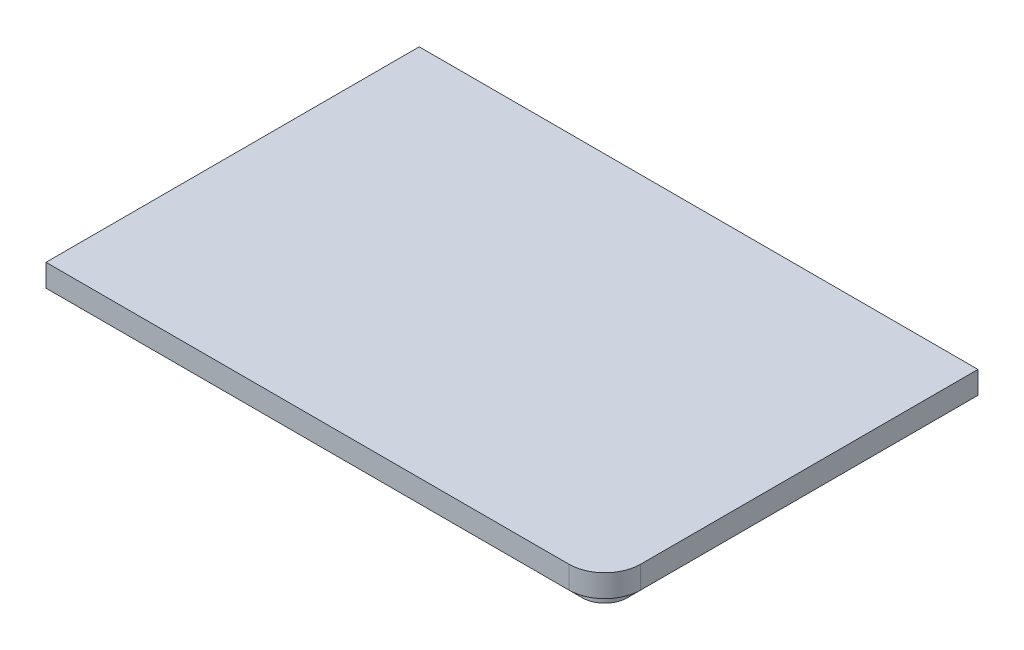
ISO-10303-21;
HEADER;
FILE_DESCRIPTION(('STEP AP214'),'2;1');
FILE_NAME('part.step','',(''),(''),'','','');
FILE_SCHEMA(('AUTOMOTIVE_DESIGN { 1 0 10303 214 1 1 1 1 }'));
ENDSEC;
DATA;
#1=APPLICATION_CONTEXT('core data for automotive mechanical design processes');
#2=APPLICATION_PROTOCOL_DEFINITION('international standard','automotive_design',2000,#1);
#3=PRODUCT_CONTEXT('',#1,'mechanical');
#4=PRODUCT('Part','Part','',(#3));
#5=PRODUCT_RELATED_PRODUCT_CATEGORY('part','',(#4));
#6=PRODUCT_DEFINITION_FORMATION('','',#4);
#7=PRODUCT_DEFINITION_CONTEXT('part definition',#1,'design');
#8=PRODUCT_DEFINITION('design','',#6,#7);
#9=PRODUCT_DEFINITION_SHAPE('','',#8);
#10=(LENGTH_UNIT() NAMED_UNIT(*) SI_UNIT(.MILLI.,.METRE.));
#11=(NAMED_UNIT(*) PLANE_ANGLE_UNIT() SI_UNIT($,.RADIAN.));
#12=(NAMED_UNIT(*) SI_UNIT($,.STERADIAN.) SOLID_ANGLE_UNIT());
#13=UNCERTAINTY_MEASURE_WITH_UNIT(LENGTH_MEASURE(1.E-05),#10,'distance_accuracy_value','');
#14=(GEOMETRIC_REPRESENTATION_CONTEXT(3) GLOBAL_UNCERTAINTY_ASSIGNED_CONTEXT((#13)) GLOBAL_UNIT_ASSIGNED_CONTEXT((#10,
#11,#12)) REPRESENTATION_CONTEXT('',''));
#15=CARTESIAN_POINT('',(0.,0.,0.));
#16=DIRECTION('',(0.,0.,1.));
#17=DIRECTION('',(1.,0.,0.));
#18=AXIS2_PLACEMENT_3D('',#15,#16,#17);
#19=CARTESIAN_POINT('',(54.245,0.,33.575));
#20=DIRECTION('',(0.,1.,0.));
#21=DIRECTION('',(0.,0.,1.));
#22=AXIS2_PLACEMENT_3D('',#19,#20,#21);
#23=PLANE('',#22);
#24=DIRECTION('',(0.,0.,1.));
#25=VECTOR('',#24,1.);
#26=CARTESIAN_POINT('',(-62.245,0.,41.575));
#27=LINE('',#26,#25);
#28=CARTESIAN_POINT('',(-62.245,0.,36.575));
#29=VERTEX_POINT('',#28);
#30=CARTESIAN_POINT('',(-62.245,0.,41.575));
#31=VERTEX_POINT('',#30);
#32=EDGE_CURVE('E125',#29,#31,#27,.T.);
#33=ORIENTED_EDGE('',*,*,#32,.F.);
#34=DIRECTION('',(1.,0.,0.));
#35=VECTOR('',#34,1.);
#36=CARTESIAN_POINT('',(-62.245,0.,36.575));
#37=LINE('',#36,#35);
#38=CARTESIAN_POINT('',(52.245,0.,36.575));
#39=VERTEX_POINT('',#38);
#40=EDGE_CURVE('E271',#29,#39,#37,.T.);
#41=ORIENTED_EDGE('',*,*,#40,.T.);
#42=CARTESIAN_POINT('',(52.245,0.,31.575));
#43=DIRECTION('',(0.,1.,0.));
#44=DIRECTION('',(0.,0.,1.));
#45=AXIS2_PLACEMENT_3D('',#42,#43,#44);
#46=CIRCLE('',#45,5.);
#47=CARTESIAN_POINT('',(57.245,0.,31.575));
#48=VERTEX_POINT('',#47);
#49=EDGE_CURVE('E187',#39,#48,#46,.T.);
#50=ORIENTED_EDGE('',*,*,#49,.T.);
#51=DIRECTION('',(0.,0.,-1.));
#52=VECTOR('',#51,1.);
#53=CARTESIAN_POINT('',(57.245,0.,31.575));
#54=LINE('',#53,#52);
#55=CARTESIAN_POINT('',(57.245,0.,-36.575));
#56=VERTEX_POINT('',#55);
#57=EDGE_CURVE('E173',#48,#56,#54,.T.);
#58=ORIENTED_EDGE('',*,*,#57,.T.);
#59=DIRECTION('',(-1.,0.,0.));
#60=VECTOR('',#59,1.);
#61=CARTESIAN_POINT('',(57.245,0.,-36.575));
#62=LINE('',#61,#60);
#63=CARTESIAN_POINT('',(-62.245,0.,-36.575));
#64=VERTEX_POINT('',#63);
#65=EDGE_CURVE('E169',#56,#64,#62,.T.);
#66=ORIENTED_EDGE('',*,*,#65,.T.);
#67=CARTESIAN_POINT('',(-62.245,0.,-41.575));
#68=VERTEX_POINT('',#67);
#69=EDGE_CURVE('E147',#68,#64,#27,.T.);
#70=ORIENTED_EDGE('',*,*,#69,.F.);
#71=DIRECTION('',(-1.,0.,0.));
#72=VECTOR('',#71,1.);
#73=CARTESIAN_POINT('',(-62.245,0.,-41.575));
#74=LINE('',#73,#72);
#75=CARTESIAN_POINT('',(62.245,0.,-41.575));
#76=VERTEX_POINT('',#75);
#77=EDGE_CURVE('E143',#76,#68,#74,.T.);
#78=ORIENTED_EDGE('',*,*,#77,.F.);
#79=DIRECTION('',(0.,0.,-1.));
#80=VECTOR('',#79,1.);
#81=CARTESIAN_POINT('',(62.245,0.,33.575));
#82=LINE('',#81,#80);
#83=CARTESIAN_POINT('',(62.245,0.,33.575));
#84=VERTEX_POINT('',#83);
#85=EDGE_CURVE('E139',#84,#76,#82,.T.);
#86=ORIENTED_EDGE('',*,*,#85,.F.);
#87=CARTESIAN_POINT('',(54.245,0.,33.575));
#88=DIRECTION('',(0.,1.,0.));
#89=DIRECTION('',(0.,0.,1.));
#90=AXIS2_PLACEMENT_3D('',#87,#88,#89);
#91=CIRCLE('',#90,8.);
#92=CARTESIAN_POINT('',(54.245,0.,41.575));
#93=VERTEX_POINT('',#92);
#94=EDGE_CURVE('E94',#93,#84,#91,.T.);
#95=ORIENTED_EDGE('',*,*,#94,.F.);
#96=DIRECTION('',(1.,0.,0.));
#97=VECTOR('',#96,1.);
#98=CARTESIAN_POINT('',(-62.245,0.,41.575));
#99=LINE('',#98,#97);
#100=EDGE_CURVE('E150',#31,#93,#99,.T.);
#101=ORIENTED_EDGE('',*,*,#100,.F.);
#102=EDGE_LOOP('',(#33,#41,#50,#58,#66,#70,#78,#86,#95,#101));
#103=FACE_BOUND('',#102,.T.);
#104=ADVANCED_FACE('F45',(#103),#23,.F.);
#105=CARTESIAN_POINT('',(62.245,5.,33.575));
#106=DIRECTION('',(-1.,0.,0.));
#107=DIRECTION('',(0.,0.,1.));
#108=AXIS2_PLACEMENT_3D('',#105,#106,#107);
#109=PLANE('',#108);
#110=ORIENTED_EDGE('',*,*,#85,.T.);
#111=DIRECTION('',(0.,-1.,0.));
#112=VECTOR('',#111,1.);
#113=CARTESIAN_POINT('',(62.245,5.,-41.575));
#114=LINE('',#113,#112);
#115=CARTESIAN_POINT('',(62.245,5.,-41.575));
#116=VERTEX_POINT('',#115);
#117=EDGE_CURVE('E11',#116,#76,#114,.T.);
#118=ORIENTED_EDGE('',*,*,#117,.F.);
#119=DIRECTION('',(0.,0.,-1.));
#120=VECTOR('',#119,1.);
#121=CARTESIAN_POINT('',(62.245,5.,33.575));
#122=LINE('',#121,#120);
#123=CARTESIAN_POINT('',(62.245,5.,33.575));
#124=VERTEX_POINT('',#123);
#125=EDGE_CURVE('E156',#124,#116,#122,.T.);
#126=ORIENTED_EDGE('',*,*,#125,.F.);
#127=DIRECTION('',(0.,-1.,0.));
#128=VECTOR('',#127,1.);
#129=CARTESIAN_POINT('',(62.245,5.,33.575));
#130=LINE('',#129,#128);
#131=EDGE_CURVE('E135',#124,#84,#130,.T.);
#132=ORIENTED_EDGE('',*,*,#131,.T.);
#133=EDGE_LOOP('',(#110,#118,#126,#132));
#134=FACE_BOUND('',#133,.T.);
#135=ADVANCED_FACE('F47',(#134),#109,.F.);
#136=CARTESIAN_POINT('',(-62.245,5.,-41.575));
#137=DIRECTION('',(0.,0.,1.));
#138=DIRECTION('',(1.,0.,0.));
#139=AXIS2_PLACEMENT_3D('',#136,#137,#138);
#140=PLANE('',#139);
#141=ORIENTED_EDGE('',*,*,#77,.T.);
#142=DIRECTION('',(0.,-1.,0.));
#143=VECTOR('',#142,1.);
#144=CARTESIAN_POINT('',(-62.245,5.,-41.575));
#145=LINE('',#144,#143);
#146=CARTESIAN_POINT('',(-62.245,5.,-41.575));
#147=VERTEX_POINT('',#146);
#148=EDGE_CURVE('E54',#147,#68,#145,.T.);
#149=ORIENTED_EDGE('',*,*,#148,.F.);
#150=DIRECTION('',(-1.,0.,0.));
#151=VECTOR('',#150,1.);
#152=CARTESIAN_POINT('',(-62.245,5.,-41.575));
#153=LINE('',#152,#151);
#154=EDGE_CURVE('E102',#116,#147,#153,.T.);
#155=ORIENTED_EDGE('',*,*,#154,.F.);
#156=ORIENTED_EDGE('',*,*,#117,.T.);
#157=EDGE_LOOP('',(#141,#149,#155,#156));
#158=FACE_BOUND('',#157,.T.);
#159=ADVANCED_FACE('F346',(#158),#140,.F.);
#160=CARTESIAN_POINT('',(-62.245,5.,41.575));
#161=DIRECTION('',(1.,0.,0.));
#162=DIRECTION('',(0.,0.,-1.));
#163=AXIS2_PLACEMENT_3D('',#160,#161,#162);
#164=PLANE('',#163);
#165=ORIENTED_EDGE('',*,*,#69,.T.);
#166=DIRECTION('',(0.,1.,0.));
#167=VECTOR('',#166,1.);
#168=CARTESIAN_POINT('',(-62.245,-5.,-36.575));
#169=LINE('',#168,#167);
#170=CARTESIAN_POINT('',(-62.245,-5.,-36.575));
#171=VERTEX_POINT('',#170);
#172=EDGE_CURVE('E205',#171,#64,#169,.T.);
#173=ORIENTED_EDGE('',*,*,#172,.F.);
#174=DIRECTION('',(0.,0.,1.));
#175=VECTOR('',#174,1.);
#176=CARTESIAN_POINT('',(-62.245,-5.,-31.575));
#177=LINE('',#176,#175);
#178=CARTESIAN_POINT('',(-62.245,-5.,-31.575));
#179=VERTEX_POINT('',#178);
#180=EDGE_CURVE('E239',#171,#179,#177,.T.);
#181=ORIENTED_EDGE('',*,*,#180,.T.);
#182=DIRECTION('',(0.,1.,0.));
#183=VECTOR('',#182,1.);
#184=CARTESIAN_POINT('',(-62.245,-5.,-31.575));
#185=LINE('',#184,#183);
#186=CARTESIAN_POINT('',(-62.245,0.,-31.575));
#187=VERTEX_POINT('',#186);
#188=EDGE_CURVE('E201',#179,#187,#185,.T.);
#189=ORIENTED_EDGE('',*,*,#188,.T.);
#190=CARTESIAN_POINT('',(-62.245,0.,31.575));
#191=VERTEX_POINT('',#190);
#192=EDGE_CURVE('E151',#187,#191,#27,.T.);
#193=ORIENTED_EDGE('',*,*,#192,.T.);
#194=DIRECTION('',(0.,1.,0.));
#195=VECTOR('',#194,1.);
#196=CARTESIAN_POINT('',(-62.245,-5.,31.575));
#197=LINE('',#196,#195);
#198=CARTESIAN_POINT('',(-62.245,-5.,31.575));
#199=VERTEX_POINT('',#198);
#200=EDGE_CURVE('E223',#199,#191,#197,.T.);
#201=ORIENTED_EDGE('',*,*,#200,.F.);
#202=DIRECTION('',(0.,0.,1.));
#203=VECTOR('',#202,1.);
#204=CARTESIAN_POINT('',(-62.245,-5.,36.575));
#205=LINE('',#204,#203);
#206=CARTESIAN_POINT('',(-62.245,-5.,36.575));
#207=VERTEX_POINT('',#206);
#208=EDGE_CURVE('E259',#199,#207,#205,.T.);
#209=ORIENTED_EDGE('',*,*,#208,.T.);
#210=DIRECTION('',(0.,1.,0.));
#211=VECTOR('',#210,1.);
#212=CARTESIAN_POINT('',(-62.245,-5.,36.575));
#213=LINE('',#212,#211);
#214=EDGE_CURVE('E220',#207,#29,#213,.T.);
#215=ORIENTED_EDGE('',*,*,#214,.T.);
#216=ORIENTED_EDGE('',*,*,#32,.T.);
#217=DIRECTION('',(0.,-1.,0.));
#218=VECTOR('',#217,1.);
#219=CARTESIAN_POINT('',(-62.245,5.,41.575));
#220=LINE('',#219,#218);
#221=CARTESIAN_POINT('',(-62.245,5.,41.575));
#222=VERTEX_POINT('',#221);
#223=EDGE_CURVE('E120',#222,#31,#220,.T.);
#224=ORIENTED_EDGE('',*,*,#223,.F.);
#225=DIRECTION('',(0.,0.,1.));
#226=VECTOR('',#225,1.);
#227=CARTESIAN_POINT('',(-62.245,5.,41.575));
#228=LINE('',#227,#226);
#229=EDGE_CURVE('E109',#147,#222,#228,.T.);
#230=ORIENTED_EDGE('',*,*,#229,.F.);
#231=ORIENTED_EDGE('',*,*,#148,.T.);
#232=EDGE_LOOP('',(#165,#173,#181,#189,#193,#201,#209,#215,#216,#224,#230,#231));
#233=FACE_BOUND('',#232,.T.);
#234=ADVANCED_FACE('F122',(#233),#164,.F.);
#235=CARTESIAN_POINT('',(-62.245,5.,41.575));
#236=DIRECTION('',(0.,0.,-1.));
#237=DIRECTION('',(-1.,0.,0.));
#238=AXIS2_PLACEMENT_3D('',#235,#236,#237);
#239=PLANE('',#238);
#240=ORIENTED_EDGE('',*,*,#100,.T.);
#241=DIRECTION('',(0.,-1.,0.));
#242=VECTOR('',#241,1.);
#243=CARTESIAN_POINT('',(54.245,5.,41.575));
#244=LINE('',#243,#242);
#245=CARTESIAN_POINT('',(54.245,5.,41.575));
#246=VERTEX_POINT('',#245);
#247=EDGE_CURVE('E129',#246,#93,#244,.T.);
#248=ORIENTED_EDGE('',*,*,#247,.F.);
#249=DIRECTION('',(1.,0.,0.));
#250=VECTOR('',#249,1.);
#251=CARTESIAN_POINT('',(-62.245,5.,41.575));
#252=LINE('',#251,#250);
#253=EDGE_CURVE('E113',#222,#246,#252,.T.);
#254=ORIENTED_EDGE('',*,*,#253,.F.);
#255=ORIENTED_EDGE('',*,*,#223,.T.);
#256=EDGE_LOOP('',(#240,#248,#254,#255));
#257=FACE_BOUND('',#256,.T.);
#258=ADVANCED_FACE('F131',(#257),#239,.F.);
#259=CARTESIAN_POINT('',(54.245,5.,33.575));
#260=DIRECTION('',(0.,-1.,0.));
#261=DIRECTION('',(0.,0.,-1.));
#262=AXIS2_PLACEMENT_3D('',#259,#260,#261);
#263=CYLINDRICAL_SURFACE('',#262,8.);
#264=ORIENTED_EDGE('',*,*,#94,.T.);
#265=ORIENTED_EDGE('',*,*,#131,.F.);
#266=CARTESIAN_POINT('',(54.245,5.,33.575));
#267=DIRECTION('',(0.,1.,0.));
#268=DIRECTION('',(0.,0.,1.));
#269=AXIS2_PLACEMENT_3D('',#266,#267,#268);
#270=CIRCLE('',#269,8.);
#271=EDGE_CURVE('E70',#246,#124,#270,.T.);
#272=ORIENTED_EDGE('',*,*,#271,.F.);
#273=ORIENTED_EDGE('',*,*,#247,.T.);
#274=EDGE_LOOP('',(#264,#265,#272,#273));
#275=FACE_BOUND('',#274,.T.);
#276=ADVANCED_FACE('F353',(#275),#263,.T.);
#277=CARTESIAN_POINT('',(54.245,5.,33.575));
#278=DIRECTION('',(0.,1.,0.));
#279=DIRECTION('',(0.,0.,1.));
#280=AXIS2_PLACEMENT_3D('',#277,#278,#279);
#281=PLANE('',#280);
#282=ORIENTED_EDGE('',*,*,#125,.T.);
#283=ORIENTED_EDGE('',*,*,#154,.T.);
#284=ORIENTED_EDGE('',*,*,#229,.T.);
#285=ORIENTED_EDGE('',*,*,#253,.T.);
#286=ORIENTED_EDGE('',*,*,#271,.T.);
#287=EDGE_LOOP('',(#282,#283,#284,#285,#286));
#288=FACE_BOUND('',#287,.T.);
#289=ADVANCED_FACE('F111',(#288),#281,.T.);
#290=DIRECTION('',(0.,0.,1.));
#291=VECTOR('',#290,1.);
#292=CARTESIAN_POINT('',(52.245,0.,31.575));
#293=LINE('',#292,#291);
#294=CARTESIAN_POINT('',(52.245,0.,-31.575));
#295=VERTEX_POINT('',#294);
#296=CARTESIAN_POINT('',(52.245,0.,31.575));
#297=VERTEX_POINT('',#296);
#298=EDGE_CURVE('E185',#295,#297,#293,.T.);
#299=ORIENTED_EDGE('',*,*,#298,.T.);
#300=DIRECTION('',(-1.,0.,0.));
#301=VECTOR('',#300,1.);
#302=CARTESIAN_POINT('',(-62.245,0.,31.575));
#303=LINE('',#302,#301);
#304=EDGE_CURVE('E61',#297,#191,#303,.T.);
#305=ORIENTED_EDGE('',*,*,#304,.T.);
#306=ORIENTED_EDGE('',*,*,#192,.F.);
#307=DIRECTION('',(1.,0.,0.));
#308=VECTOR('',#307,1.);
#309=CARTESIAN_POINT('',(21.4,0.,-31.575));
#310=LINE('',#309,#308);
#311=EDGE_CURVE('E180',#187,#295,#310,.T.);
#312=ORIENTED_EDGE('',*,*,#311,.T.);
#313=EDGE_LOOP('',(#299,#305,#306,#312));
#314=FACE_BOUND('',#313,.T.);
#315=ADVANCED_FACE('F319',(#314),#23,.F.);
#316=CARTESIAN_POINT('',(-62.245,-5.,31.575));
#317=DIRECTION('',(0.,0.,-1.));
#318=DIRECTION('',(-1.,0.,0.));
#319=AXIS2_PLACEMENT_3D('',#316,#317,#318);
#320=PLANE('',#319);
#321=ORIENTED_EDGE('',*,*,#304,.F.);
#322=DIRECTION('',(0.,1.,0.));
#323=VECTOR('',#322,1.);
#324=CARTESIAN_POINT('',(52.245,-5.,31.575));
#325=LINE('',#324,#323);
#326=CARTESIAN_POINT('',(52.245,-5.,31.575));
#327=VERTEX_POINT('',#326);
#328=EDGE_CURVE('E144',#327,#297,#325,.T.);
#329=ORIENTED_EDGE('',*,*,#328,.F.);
#330=DIRECTION('',(-1.,0.,0.));
#331=VECTOR('',#330,1.);
#332=CARTESIAN_POINT('',(-62.245,-5.,31.575));
#333=LINE('',#332,#331);
#334=EDGE_CURVE('E194',#327,#199,#333,.T.);
#335=ORIENTED_EDGE('',*,*,#334,.T.);
#336=ORIENTED_EDGE('',*,*,#200,.T.);
#337=EDGE_LOOP('',(#321,#329,#335,#336));
#338=FACE_BOUND('',#337,.T.);
#339=ADVANCED_FACE('F316',(#338),#320,.T.);
#340=CARTESIAN_POINT('',(52.245,-5.,31.575));
#341=DIRECTION('',(-1.,0.,0.));
#342=DIRECTION('',(0.,0.,1.));
#343=AXIS2_PLACEMENT_3D('',#340,#341,#342);
#344=PLANE('',#343);
#345=ORIENTED_EDGE('',*,*,#298,.F.);
#346=DIRECTION('',(0.,1.,0.));
#347=VECTOR('',#346,1.);
#348=CARTESIAN_POINT('',(52.245,-5.,-31.575));
#349=LINE('',#348,#347);
#350=CARTESIAN_POINT('',(52.245,-5.,-31.575));
#351=VERTEX_POINT('',#350);
#352=EDGE_CURVE('E197',#351,#295,#349,.T.);
#353=ORIENTED_EDGE('',*,*,#352,.F.);
#354=DIRECTION('',(0.,0.,1.));
#355=VECTOR('',#354,1.);
#356=CARTESIAN_POINT('',(52.245,-5.,31.575));
#357=LINE('',#356,#355);
#358=EDGE_CURVE('E226',#351,#327,#357,.T.);
#359=ORIENTED_EDGE('',*,*,#358,.T.);
#360=ORIENTED_EDGE('',*,*,#328,.T.);
#361=EDGE_LOOP('',(#345,#353,#359,#360));
#362=FACE_BOUND('',#361,.T.);
#363=ADVANCED_FACE('F328',(#362),#344,.T.);
#364=CARTESIAN_POINT('',(21.4,-5.,-31.575));
#365=DIRECTION('',(0.,0.,1.));
#366=DIRECTION('',(1.,0.,0.));
#367=AXIS2_PLACEMENT_3D('',#364,#365,#366);
#368=PLANE('',#367);
#369=ORIENTED_EDGE('',*,*,#311,.F.);
#370=ORIENTED_EDGE('',*,*,#188,.F.);
#371=DIRECTION('',(1.,0.,0.));
#372=VECTOR('',#371,1.);
#373=CARTESIAN_POINT('',(21.4,-5.,-31.575));
#374=LINE('',#373,#372);
#375=EDGE_CURVE('E235',#179,#351,#374,.T.);
#376=ORIENTED_EDGE('',*,*,#375,.T.);
#377=ORIENTED_EDGE('',*,*,#352,.T.);
#378=EDGE_LOOP('',(#369,#370,#376,#377));
#379=FACE_BOUND('',#378,.T.);
#380=ADVANCED_FACE('F322',(#379),#368,.T.);
#381=CARTESIAN_POINT('',(57.245,-5.,-36.575));
#382=DIRECTION('',(0.,0.,-1.));
#383=DIRECTION('',(-1.,0.,0.));
#384=AXIS2_PLACEMENT_3D('',#381,#382,#383);
#385=PLANE('',#384);
#386=ORIENTED_EDGE('',*,*,#65,.F.);
#387=DIRECTION('',(0.,1.,0.));
#388=VECTOR('',#387,1.);
#389=CARTESIAN_POINT('',(57.245,-5.,-36.575));
#390=LINE('',#389,#388);
#391=CARTESIAN_POINT('',(57.245,-5.,-36.575));
#392=VERTEX_POINT('',#391);
#393=EDGE_CURVE('E208',#392,#56,#390,.T.);
#394=ORIENTED_EDGE('',*,*,#393,.F.);
#395=DIRECTION('',(-1.,0.,0.));
#396=VECTOR('',#395,1.);
#397=CARTESIAN_POINT('',(57.245,-5.,-36.575));
#398=LINE('',#397,#396);
#399=EDGE_CURVE('E243',#392,#171,#398,.T.);
#400=ORIENTED_EDGE('',*,*,#399,.T.);
#401=ORIENTED_EDGE('',*,*,#172,.T.);
#402=EDGE_LOOP('',(#386,#394,#400,#401));
#403=FACE_BOUND('',#402,.T.);
#404=ADVANCED_FACE('F335',(#403),#385,.T.);
#405=CARTESIAN_POINT('',(57.245,-5.,31.575));
#406=DIRECTION('',(1.,0.,0.));
#407=DIRECTION('',(0.,0.,-1.));
#408=AXIS2_PLACEMENT_3D('',#405,#406,#407);
#409=PLANE('',#408);
#410=ORIENTED_EDGE('',*,*,#57,.F.);
#411=DIRECTION('',(0.,1.,0.));
#412=VECTOR('',#411,1.);
#413=CARTESIAN_POINT('',(57.245,-5.,31.575));
#414=LINE('',#413,#412);
#415=CARTESIAN_POINT('',(57.245,-5.,31.575));
#416=VERTEX_POINT('',#415);
#417=EDGE_CURVE('E212',#416,#48,#414,.T.);
#418=ORIENTED_EDGE('',*,*,#417,.F.);
#419=DIRECTION('',(0.,0.,-1.));
#420=VECTOR('',#419,1.);
#421=CARTESIAN_POINT('',(57.245,-5.,31.575));
#422=LINE('',#421,#420);
#423=EDGE_CURVE('E247',#416,#392,#422,.T.);
#424=ORIENTED_EDGE('',*,*,#423,.T.);
#425=ORIENTED_EDGE('',*,*,#393,.T.);
#426=EDGE_LOOP('',(#410,#418,#424,#425));
#427=FACE_BOUND('',#426,.T.);
#428=ADVANCED_FACE('F363',(#427),#409,.T.);
#429=CARTESIAN_POINT('',(52.245,-5.,31.575));
#430=DIRECTION('',(0.,1.,0.));
#431=DIRECTION('',(0.,0.,1.));
#432=AXIS2_PLACEMENT_3D('',#429,#430,#431);
#433=CYLINDRICAL_SURFACE('',#432,5.);
#434=ORIENTED_EDGE('',*,*,#49,.F.);
#435=DIRECTION('',(0.,1.,0.));
#436=VECTOR('',#435,1.);
#437=CARTESIAN_POINT('',(52.245,-5.,36.575));
#438=LINE('',#437,#436);
#439=CARTESIAN_POINT('',(52.245,-5.,36.575));
#440=VERTEX_POINT('',#439);
#441=EDGE_CURVE('E216',#440,#39,#438,.T.);
#442=ORIENTED_EDGE('',*,*,#441,.F.);
#443=CARTESIAN_POINT('',(52.245,-5.,31.575));
#444=DIRECTION('',(0.,1.,0.));
#445=DIRECTION('',(0.,0.,1.));
#446=AXIS2_PLACEMENT_3D('',#443,#444,#445);
#447=CIRCLE('',#446,5.);
#448=EDGE_CURVE('E251',#440,#416,#447,.T.);
#449=ORIENTED_EDGE('',*,*,#448,.T.);
#450=ORIENTED_EDGE('',*,*,#417,.T.);
#451=EDGE_LOOP('',(#434,#442,#449,#450));
#452=FACE_BOUND('',#451,.T.);
#453=ADVANCED_FACE('F282',(#452),#433,.T.);
#454=CARTESIAN_POINT('',(-62.245,-5.,36.575));
#455=DIRECTION('',(0.,0.,1.));
#456=DIRECTION('',(1.,0.,0.));
#457=AXIS2_PLACEMENT_3D('',#454,#455,#456);
#458=PLANE('',#457);
#459=ORIENTED_EDGE('',*,*,#40,.F.);
#460=ORIENTED_EDGE('',*,*,#214,.F.);
#461=DIRECTION('',(1.,0.,0.));
#462=VECTOR('',#461,1.);
#463=CARTESIAN_POINT('',(-62.245,-5.,36.575));
#464=LINE('',#463,#462);
#465=EDGE_CURVE('E255',#207,#440,#464,.T.);
#466=ORIENTED_EDGE('',*,*,#465,.T.);
#467=ORIENTED_EDGE('',*,*,#441,.T.);
#468=EDGE_LOOP('',(#459,#460,#466,#467));
#469=FACE_BOUND('',#468,.T.);
#470=ADVANCED_FACE('F358',(#469),#458,.T.);
#471=CARTESIAN_POINT('',(52.245,-5.,31.575));
#472=DIRECTION('',(0.,1.,0.));
#473=DIRECTION('',(0.,0.,1.));
#474=AXIS2_PLACEMENT_3D('',#471,#472,#473);
#475=PLANE('',#474);
#476=ORIENTED_EDGE('',*,*,#334,.F.);
#477=ORIENTED_EDGE('',*,*,#358,.F.);
#478=ORIENTED_EDGE('',*,*,#375,.F.);
#479=ORIENTED_EDGE('',*,*,#180,.F.);
#480=ORIENTED_EDGE('',*,*,#399,.F.);
#481=ORIENTED_EDGE('',*,*,#423,.F.);
#482=ORIENTED_EDGE('',*,*,#448,.F.);
#483=ORIENTED_EDGE('',*,*,#465,.F.);
#484=ORIENTED_EDGE('',*,*,#208,.F.);
#485=EDGE_LOOP('',(#476,#477,#478,#479,#480,#481,#482,#483,#484));
#486=FACE_BOUND('',#485,.T.);
#487=ADVANCED_FACE('F325',(#486),#475,.F.);
#488=CLOSED_SHELL('',(#104,#135,#159,#234,#258,#276,#289,#315,#339,#363,#380,#404,#428,#453,
#470,#487));
#489=MANIFOLD_SOLID_BREP('B2',#488);
#490=ADVANCED_BREP_SHAPE_REPRESENTATION('',(#18,#489),#14);
#491=SHAPE_DEFINITION_REPRESENTATION(#9,#490);
ENDSEC;
END-ISO-10303-21;
